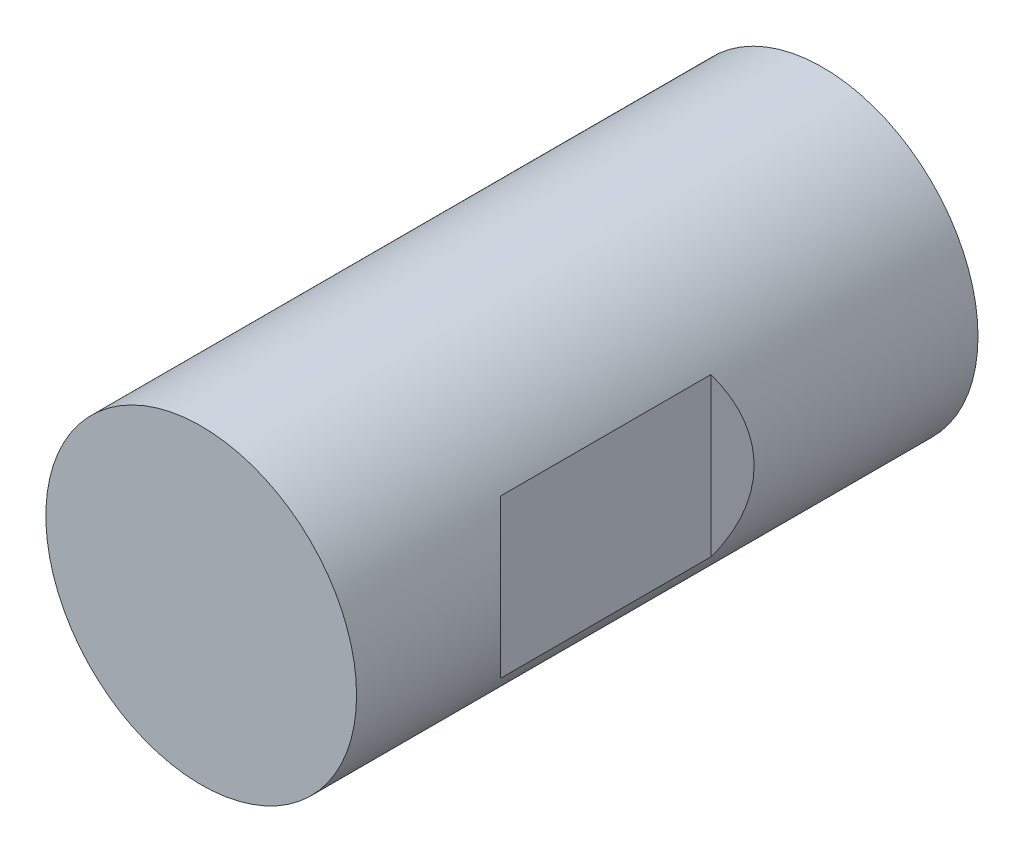
ISO-10303-21;
HEADER;
FILE_DESCRIPTION(('STEP AP214'),'2;1');
FILE_NAME('part.step','',(''),(''),'','','');
FILE_SCHEMA(('AUTOMOTIVE_DESIGN { 1 0 10303 214 1 1 1 1 }'));
ENDSEC;
DATA;
#1=APPLICATION_CONTEXT('core data for automotive mechanical design processes');
#2=APPLICATION_PROTOCOL_DEFINITION('international standard','automotive_design',2000,#1);
#3=PRODUCT_CONTEXT('',#1,'mechanical');
#4=PRODUCT('Part','Part','',(#3));
#5=PRODUCT_RELATED_PRODUCT_CATEGORY('part','',(#4));
#6=PRODUCT_DEFINITION_FORMATION('','',#4);
#7=PRODUCT_DEFINITION_CONTEXT('part definition',#1,'design');
#8=PRODUCT_DEFINITION('design','',#6,#7);
#9=PRODUCT_DEFINITION_SHAPE('','',#8);
#10=(LENGTH_UNIT() NAMED_UNIT(*) SI_UNIT(.MILLI.,.METRE.));
#11=(NAMED_UNIT(*) PLANE_ANGLE_UNIT() SI_UNIT($,.RADIAN.));
#12=(NAMED_UNIT(*) SI_UNIT($,.STERADIAN.) SOLID_ANGLE_UNIT());
#13=UNCERTAINTY_MEASURE_WITH_UNIT(LENGTH_MEASURE(1.E-05),#10,'distance_accuracy_value','');
#14=(GEOMETRIC_REPRESENTATION_CONTEXT(3) GLOBAL_UNCERTAINTY_ASSIGNED_CONTEXT((#13)) GLOBAL_UNIT_ASSIGNED_CONTEXT((#10,
#11,#12)) REPRESENTATION_CONTEXT('',''));
#15=CARTESIAN_POINT('',(0.,0.,0.));
#16=DIRECTION('',(0.,0.,1.));
#17=DIRECTION('',(1.,0.,0.));
#18=AXIS2_PLACEMENT_3D('',#15,#16,#17);
#19=CARTESIAN_POINT('',(0.,0.,62.));
#20=DIRECTION('',(0.,0.,-1.));
#21=DIRECTION('',(-1.,0.,0.));
#22=AXIS2_PLACEMENT_3D('',#19,#20,#21);
#23=CYLINDRICAL_SURFACE('',#22,15.5);
#24=CARTESIAN_POINT('',(0.,0.,32.0700678396542));
#25=DIRECTION('',(0.709214179009117,0.,-0.704993083861412));
#26=DIRECTION('',(-0.704993083861412,0.,-0.709214179009117));
#27=AXIS2_PLACEMENT_3D('',#24,#25,#26);
#28=ELLIPSE('',#27,21.9860312885665,15.5);
#29=CARTESIAN_POINT('',(13.35,7.8757539321642,45.5));
#30=VERTEX_POINT('',#29);
#31=CARTESIAN_POINT('',(13.35,-7.8757539321642,45.5));
#32=VERTEX_POINT('',#31);
#33=EDGE_CURVE('E118',#30,#32,#28,.T.);
#34=ORIENTED_EDGE('',*,*,#33,.F.);
#35=DIRECTION('',(0.,0.,-1.));
#36=VECTOR('',#35,1.);
#37=CARTESIAN_POINT('',(13.35,7.8757539321642,62.));
#38=LINE('',#37,#36);
#39=CARTESIAN_POINT('',(13.35,7.87575393216419,24.5));
#40=VERTEX_POINT('',#39);
#41=EDGE_CURVE('E84',#30,#40,#38,.T.);
#42=ORIENTED_EDGE('',*,*,#41,.T.);
#43=CARTESIAN_POINT('',(0.,0.,37.9299321603457));
#44=DIRECTION('',(-0.709214179009116,0.,-0.704993083861413));
#45=DIRECTION('',(0.704993083861413,0.,-0.709214179009116));
#46=AXIS2_PLACEMENT_3D('',#43,#44,#45);
#47=ELLIPSE('',#46,21.9860312885665,15.5);
#48=CARTESIAN_POINT('',(13.35,-7.8757539321642,24.5));
#49=VERTEX_POINT('',#48);
#50=EDGE_CURVE('E79',#40,#49,#47,.T.);
#51=ORIENTED_EDGE('',*,*,#50,.T.);
#52=DIRECTION('',(0.,0.,-1.));
#53=VECTOR('',#52,1.);
#54=CARTESIAN_POINT('',(13.35,-7.8757539321642,62.));
#55=LINE('',#54,#53);
#56=EDGE_CURVE('E82',#49,#32,#55,.F.);
#57=ORIENTED_EDGE('',*,*,#56,.T.);
#58=EDGE_LOOP('',(#34,#42,#51,#57));
#59=FACE_BOUND('',#58,.T.);
#60=CARTESIAN_POINT('',(0.,0.,62.));
#61=DIRECTION('',(0.,0.,1.));
#62=DIRECTION('',(1.,0.,0.));
#63=AXIS2_PLACEMENT_3D('',#60,#61,#62);
#64=CIRCLE('',#63,15.5);
#65=CARTESIAN_POINT('',(15.5,0.,62.));
#66=VERTEX_POINT('',#65);
#67=EDGE_CURVE('E89',#66,#66,#64,.T.);
#68=ORIENTED_EDGE('',*,*,#67,.F.);
#69=EDGE_LOOP('',(#68));
#70=FACE_BOUND('',#69,.T.);
#71=CARTESIAN_POINT('',(0.,0.,0.));
#72=DIRECTION('',(0.,0.,1.));
#73=DIRECTION('',(1.,0.,0.));
#74=AXIS2_PLACEMENT_3D('',#71,#72,#73);
#75=CIRCLE('',#74,15.5);
#76=CARTESIAN_POINT('',(15.5,0.,0.));
#77=VERTEX_POINT('',#76);
#78=EDGE_CURVE('E112',#77,#77,#75,.T.);
#79=ORIENTED_EDGE('',*,*,#78,.T.);
#80=EDGE_LOOP('',(#79));
#81=FACE_BOUND('',#80,.T.);
#82=DIRECTION('',(0.,0.,-1.));
#83=VECTOR('',#82,1.);
#84=CARTESIAN_POINT('',(-13.35,7.87575393216422,62.));
#85=LINE('',#84,#83);
#86=CARTESIAN_POINT('',(-13.35,7.87575393216422,45.5));
#87=VERTEX_POINT('',#86);
#88=CARTESIAN_POINT('',(-13.35,7.87575393216422,24.5));
#89=VERTEX_POINT('',#88);
#90=EDGE_CURVE('E11',#87,#89,#85,.T.);
#91=ORIENTED_EDGE('',*,*,#90,.F.);
#92=CARTESIAN_POINT('',(0.,0.,32.0700678396543));
#93=DIRECTION('',(0.709214179009116,0.,0.704993083861413));
#94=DIRECTION('',(0.704993083861413,0.,-0.709214179009116));
#95=AXIS2_PLACEMENT_3D('',#92,#93,#94);
#96=ELLIPSE('',#95,21.9860312885665,15.5);
#97=CARTESIAN_POINT('',(-13.35,-7.87575393216422,45.5));
#98=VERTEX_POINT('',#97);
#99=EDGE_CURVE('E121',#87,#98,#96,.T.);
#100=ORIENTED_EDGE('',*,*,#99,.T.);
#101=DIRECTION('',(0.,0.,-1.));
#102=VECTOR('',#101,1.);
#103=CARTESIAN_POINT('',(-13.35,-7.87575393216422,62.));
#104=LINE('',#103,#102);
#105=CARTESIAN_POINT('',(-13.35,-7.87575393216422,24.5));
#106=VERTEX_POINT('',#105);
#107=EDGE_CURVE('E125',#106,#98,#104,.F.);
#108=ORIENTED_EDGE('',*,*,#107,.F.);
#109=CARTESIAN_POINT('',(0.,0.,37.9299321603457));
#110=DIRECTION('',(-0.709214179009116,0.,0.704993083861413));
#111=DIRECTION('',(-0.704993083861413,0.,-0.709214179009116));
#112=AXIS2_PLACEMENT_3D('',#109,#110,#111);
#113=ELLIPSE('',#112,21.9860312885665,15.5);
#114=EDGE_CURVE('E47',#89,#106,#113,.T.);
#115=ORIENTED_EDGE('',*,*,#114,.F.);
#116=EDGE_LOOP('',(#91,#100,#108,#115));
#117=FACE_BOUND('',#116,.T.);
#118=ADVANCED_FACE('F39',(#59,#70,#81,#117),#23,.T.);
#119=CARTESIAN_POINT('',(0.,0.,62.));
#120=DIRECTION('',(0.,0.,1.));
#121=DIRECTION('',(1.,0.,0.));
#122=AXIS2_PLACEMENT_3D('',#119,#120,#121);
#123=PLANE('',#122);
#124=ORIENTED_EDGE('',*,*,#67,.T.);
#125=EDGE_LOOP('',(#124));
#126=FACE_BOUND('',#125,.T.);
#127=ADVANCED_FACE('F143',(#126),#123,.T.);
#128=CARTESIAN_POINT('',(0.,0.,0.));
#129=DIRECTION('',(0.,0.,1.));
#130=DIRECTION('',(1.,0.,0.));
#131=AXIS2_PLACEMENT_3D('',#128,#129,#130);
#132=PLANE('',#131);
#133=ORIENTED_EDGE('',*,*,#78,.F.);
#134=EDGE_LOOP('',(#133));
#135=FACE_BOUND('',#134,.T.);
#136=ADVANCED_FACE('F147',(#135),#132,.F.);
#137=CARTESIAN_POINT('',(15.5,-15.5,47.6628729696437));
#138=DIRECTION('',(0.709214179009117,0.,-0.704993083861412));
#139=DIRECTION('',(-0.704993083861412,0.,-0.709214179009117));
#140=AXIS2_PLACEMENT_3D('',#137,#138,#139);
#141=PLANE('',#140);
#142=DIRECTION('',(0.,1.,0.));
#143=VECTOR('',#142,1.);
#144=CARTESIAN_POINT('',(13.35,-15.5,45.5));
#145=LINE('',#144,#143);
#146=EDGE_CURVE('E96',#32,#30,#145,.T.);
#147=ORIENTED_EDGE('',*,*,#146,.T.);
#148=ORIENTED_EDGE('',*,*,#33,.T.);
#149=EDGE_LOOP('',(#147,#148));
#150=FACE_BOUND('',#149,.T.);
#151=ADVANCED_FACE('F153',(#150),#141,.T.);
#152=CARTESIAN_POINT('',(13.35,-15.5,24.5));
#153=DIRECTION('',(-1.,0.,0.));
#154=DIRECTION('',(0.,0.,1.));
#155=AXIS2_PLACEMENT_3D('',#152,#153,#154);
#156=PLANE('',#155);
#157=ORIENTED_EDGE('',*,*,#146,.F.);
#158=ORIENTED_EDGE('',*,*,#56,.F.);
#159=DIRECTION('',(0.,1.,0.));
#160=VECTOR('',#159,1.);
#161=CARTESIAN_POINT('',(13.35,-15.5,24.5));
#162=LINE('',#161,#160);
#163=EDGE_CURVE('E94',#49,#40,#162,.T.);
#164=ORIENTED_EDGE('',*,*,#163,.T.);
#165=ORIENTED_EDGE('',*,*,#41,.F.);
#166=EDGE_LOOP('',(#157,#158,#164,#165));
#167=FACE_BOUND('',#166,.T.);
#168=ADVANCED_FACE('F93',(#167),#156,.F.);
#169=CARTESIAN_POINT('',(15.5,-15.5,22.3371270303563));
#170=DIRECTION('',(-0.709214179009116,0.,-0.704993083861413));
#171=DIRECTION('',(-0.704993083861413,0.,0.709214179009116));
#172=AXIS2_PLACEMENT_3D('',#169,#170,#171);
#173=PLANE('',#172);
#174=ORIENTED_EDGE('',*,*,#50,.F.);
#175=ORIENTED_EDGE('',*,*,#163,.F.);
#176=EDGE_LOOP('',(#174,#175));
#177=FACE_BOUND('',#176,.T.);
#178=ADVANCED_FACE('F99',(#177),#173,.F.);
#179=CARTESIAN_POINT('',(-15.5,-15.5,22.3371270303563));
#180=DIRECTION('',(-0.709214179009116,0.,0.704993083861413));
#181=DIRECTION('',(0.704993083861413,0.,0.709214179009116));
#182=AXIS2_PLACEMENT_3D('',#179,#180,#181);
#183=PLANE('',#182);
#184=ORIENTED_EDGE('',*,*,#114,.T.);
#185=DIRECTION('',(0.,1.,0.));
#186=VECTOR('',#185,1.);
#187=CARTESIAN_POINT('',(-13.35,-15.5,24.5));
#188=LINE('',#187,#186);
#189=EDGE_CURVE('E104',#106,#89,#188,.T.);
#190=ORIENTED_EDGE('',*,*,#189,.T.);
#191=EDGE_LOOP('',(#184,#190));
#192=FACE_BOUND('',#191,.T.);
#193=ADVANCED_FACE('F130',(#192),#183,.T.);
#194=CARTESIAN_POINT('',(-13.35,-15.5,24.5));
#195=DIRECTION('',(-1.,0.,0.));
#196=DIRECTION('',(0.,0.,1.));
#197=AXIS2_PLACEMENT_3D('',#194,#195,#196);
#198=PLANE('',#197);
#199=ORIENTED_EDGE('',*,*,#90,.T.);
#200=ORIENTED_EDGE('',*,*,#189,.F.);
#201=ORIENTED_EDGE('',*,*,#107,.T.);
#202=DIRECTION('',(0.,1.,0.));
#203=VECTOR('',#202,1.);
#204=CARTESIAN_POINT('',(-13.35,-15.5,45.5));
#205=LINE('',#204,#203);
#206=EDGE_CURVE('E53',#98,#87,#205,.T.);
#207=ORIENTED_EDGE('',*,*,#206,.T.);
#208=EDGE_LOOP('',(#199,#200,#201,#207));
#209=FACE_BOUND('',#208,.T.);
#210=ADVANCED_FACE('F133',(#209),#198,.T.);
#211=CARTESIAN_POINT('',(-15.5,-15.5,47.6628729696437));
#212=DIRECTION('',(0.709214179009116,0.,0.704993083861413));
#213=DIRECTION('',(0.704993083861413,0.,-0.709214179009116));
#214=AXIS2_PLACEMENT_3D('',#211,#212,#213);
#215=PLANE('',#214);
#216=ORIENTED_EDGE('',*,*,#206,.F.);
#217=ORIENTED_EDGE('',*,*,#99,.F.);
#218=EDGE_LOOP('',(#216,#217));
#219=FACE_BOUND('',#218,.T.);
#220=ADVANCED_FACE('F135',(#219),#215,.F.);
#221=CLOSED_SHELL('',(#118,#127,#136,#151,#168,#178,#193,#210,#220));
#222=MANIFOLD_SOLID_BREP('B2',#221);
#223=ADVANCED_BREP_SHAPE_REPRESENTATION('',(#18,#222),#14);
#224=SHAPE_DEFINITION_REPRESENTATION(#9,#223);
ENDSEC;
END-ISO-10303-21;
